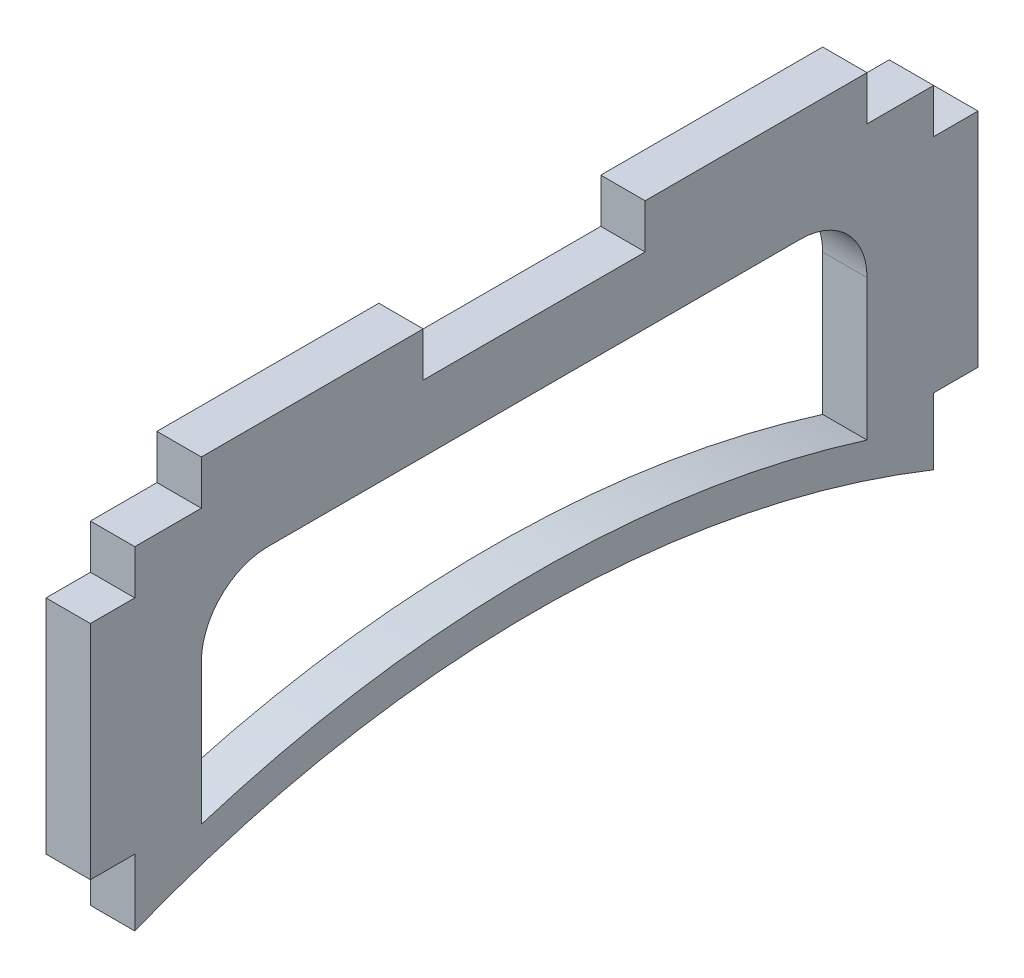
ISO-10303-21;
HEADER;
FILE_DESCRIPTION(('STEP AP214'),'2;1');
FILE_NAME('part.step','',(''),(''),'','','');
FILE_SCHEMA(('AUTOMOTIVE_DESIGN { 1 0 10303 214 1 1 1 1 }'));
ENDSEC;
DATA;
#1=APPLICATION_CONTEXT('core data for automotive mechanical design processes');
#2=APPLICATION_PROTOCOL_DEFINITION('international standard','automotive_design',2000,#1);
#3=PRODUCT_CONTEXT('',#1,'mechanical');
#4=PRODUCT('Part','Part','',(#3));
#5=PRODUCT_RELATED_PRODUCT_CATEGORY('part','',(#4));
#6=PRODUCT_DEFINITION_FORMATION('','',#4);
#7=PRODUCT_DEFINITION_CONTEXT('part definition',#1,'design');
#8=PRODUCT_DEFINITION('design','',#6,#7);
#9=PRODUCT_DEFINITION_SHAPE('','',#8);
#10=(LENGTH_UNIT() NAMED_UNIT(*) SI_UNIT(.MILLI.,.METRE.));
#11=(NAMED_UNIT(*) PLANE_ANGLE_UNIT() SI_UNIT($,.RADIAN.));
#12=(NAMED_UNIT(*) SI_UNIT($,.STERADIAN.) SOLID_ANGLE_UNIT());
#13=UNCERTAINTY_MEASURE_WITH_UNIT(LENGTH_MEASURE(1.E-05),#10,'distance_accuracy_value','');
#14=(GEOMETRIC_REPRESENTATION_CONTEXT(3) GLOBAL_UNCERTAINTY_ASSIGNED_CONTEXT((#13)) GLOBAL_UNIT_ASSIGNED_CONTEXT((#10,
#11,#12)) REPRESENTATION_CONTEXT('',''));
#15=CARTESIAN_POINT('',(0.,0.,0.));
#16=DIRECTION('',(0.,0.,1.));
#17=DIRECTION('',(1.,0.,0.));
#18=AXIS2_PLACEMENT_3D('',#15,#16,#17);
#19=CARTESIAN_POINT('',(2.,-60.0360966337004,0.));
#20=DIRECTION('',(1.,0.,0.));
#21=DIRECTION('',(0.,0.,-1.));
#22=AXIS2_PLACEMENT_3D('',#19,#20,#21);
#23=PLANE('',#22);
#24=DIRECTION('',(0.,-1.,0.));
#25=VECTOR('',#24,1.);
#26=CARTESIAN_POINT('',(2.,0.,18.));
#27=LINE('',#26,#25);
#28=CARTESIAN_POINT('',(2.,0.,18.));
#29=VERTEX_POINT('',#28);
#30=CARTESIAN_POINT('',(2.,-2.,18.));
#31=VERTEX_POINT('',#30);
#32=EDGE_CURVE('E258',#29,#31,#27,.T.);
#33=ORIENTED_EDGE('',*,*,#32,.T.);
#34=DIRECTION('',(0.,0.,1.));
#35=VECTOR('',#34,1.);
#36=CARTESIAN_POINT('',(2.,-2.,18.));
#37=LINE('',#36,#35);
#38=CARTESIAN_POINT('',(2.,-2.,20.));
#39=VERTEX_POINT('',#38);
#40=EDGE_CURVE('E261',#31,#39,#37,.T.);
#41=ORIENTED_EDGE('',*,*,#40,.T.);
#42=DIRECTION('',(0.,-1.,0.));
#43=VECTOR('',#42,1.);
#44=CARTESIAN_POINT('',(2.,-2.,20.));
#45=LINE('',#44,#43);
#46=CARTESIAN_POINT('',(2.,-12.,20.));
#47=VERTEX_POINT('',#46);
#48=EDGE_CURVE('E264',#39,#47,#45,.T.);
#49=ORIENTED_EDGE('',*,*,#48,.T.);
#50=DIRECTION('',(0.,0.,-1.));
#51=VECTOR('',#50,1.);
#52=CARTESIAN_POINT('',(2.,-12.,20.));
#53=LINE('',#52,#51);
#54=CARTESIAN_POINT('',(2.,-12.,18.));
#55=VERTEX_POINT('',#54);
#56=EDGE_CURVE('E266',#47,#55,#53,.T.);
#57=ORIENTED_EDGE('',*,*,#56,.T.);
#58=DIRECTION('',(0.,-1.,0.));
#59=VECTOR('',#58,1.);
#60=CARTESIAN_POINT('',(2.,-12.,18.));
#61=LINE('',#60,#59);
#62=CARTESIAN_POINT('',(2.,-15.,18.));
#63=VERTEX_POINT('',#62);
#64=EDGE_CURVE('E268',#55,#63,#61,.T.);
#65=ORIENTED_EDGE('',*,*,#64,.T.);
#66=CARTESIAN_POINT('',(2.,-60.0360966337004,0.));
#67=DIRECTION('',(-1.,0.,0.));
#68=DIRECTION('',(0.,0.,-1.));
#69=AXIS2_PLACEMENT_3D('',#66,#67,#68);
#70=CIRCLE('',#69,48.5);
#71=CARTESIAN_POINT('',(2.,-15.,-18.));
#72=VERTEX_POINT('',#71);
#73=EDGE_CURVE('E270',#63,#72,#70,.T.);
#74=ORIENTED_EDGE('',*,*,#73,.T.);
#75=DIRECTION('',(0.,1.,0.));
#76=VECTOR('',#75,1.);
#77=CARTESIAN_POINT('',(2.,-12.,-18.));
#78=LINE('',#77,#76);
#79=CARTESIAN_POINT('',(2.,-12.,-18.));
#80=VERTEX_POINT('',#79);
#81=EDGE_CURVE('E272',#72,#80,#78,.T.);
#82=ORIENTED_EDGE('',*,*,#81,.T.);
#83=DIRECTION('',(0.,0.,-1.));
#84=VECTOR('',#83,1.);
#85=CARTESIAN_POINT('',(2.,-12.,-20.));
#86=LINE('',#85,#84);
#87=CARTESIAN_POINT('',(2.,-12.,-20.));
#88=VERTEX_POINT('',#87);
#89=EDGE_CURVE('E274',#80,#88,#86,.T.);
#90=ORIENTED_EDGE('',*,*,#89,.T.);
#91=DIRECTION('',(0.,1.,0.));
#92=VECTOR('',#91,1.);
#93=CARTESIAN_POINT('',(2.,-2.,-20.));
#94=LINE('',#93,#92);
#95=CARTESIAN_POINT('',(2.,-2.,-20.));
#96=VERTEX_POINT('',#95);
#97=EDGE_CURVE('E276',#88,#96,#94,.T.);
#98=ORIENTED_EDGE('',*,*,#97,.T.);
#99=DIRECTION('',(0.,0.,1.));
#100=VECTOR('',#99,1.);
#101=CARTESIAN_POINT('',(2.,-2.,-18.));
#102=LINE('',#101,#100);
#103=CARTESIAN_POINT('',(2.,-2.,-18.));
#104=VERTEX_POINT('',#103);
#105=EDGE_CURVE('E278',#96,#104,#102,.T.);
#106=ORIENTED_EDGE('',*,*,#105,.T.);
#107=DIRECTION('',(0.,1.,0.));
#108=VECTOR('',#107,1.);
#109=CARTESIAN_POINT('',(2.,0.,-18.));
#110=LINE('',#109,#108);
#111=CARTESIAN_POINT('',(2.,0.,-18.));
#112=VERTEX_POINT('',#111);
#113=EDGE_CURVE('E280',#104,#112,#110,.T.);
#114=ORIENTED_EDGE('',*,*,#113,.T.);
#115=DIRECTION('',(0.,0.,1.));
#116=VECTOR('',#115,1.);
#117=CARTESIAN_POINT('',(2.,0.,-15.));
#118=LINE('',#117,#116);
#119=CARTESIAN_POINT('',(2.,0.,-15.));
#120=VERTEX_POINT('',#119);
#121=EDGE_CURVE('E282',#112,#120,#118,.T.);
#122=ORIENTED_EDGE('',*,*,#121,.T.);
#123=DIRECTION('',(0.,1.,0.));
#124=VECTOR('',#123,1.);
#125=CARTESIAN_POINT('',(2.,0.,-15.));
#126=LINE('',#125,#124);
#127=CARTESIAN_POINT('',(2.,2.00000000000001,-15.));
#128=VERTEX_POINT('',#127);
#129=EDGE_CURVE('E284',#120,#128,#126,.T.);
#130=ORIENTED_EDGE('',*,*,#129,.T.);
#131=DIRECTION('',(0.,0.,1.));
#132=VECTOR('',#131,1.);
#133=CARTESIAN_POINT('',(2.,2.00000000000001,-15.));
#134=LINE('',#133,#132);
#135=CARTESIAN_POINT('',(2.,2.00000000000001,-5.));
#136=VERTEX_POINT('',#135);
#137=EDGE_CURVE('E286',#128,#136,#134,.T.);
#138=ORIENTED_EDGE('',*,*,#137,.T.);
#139=DIRECTION('',(0.,-1.,0.));
#140=VECTOR('',#139,1.);
#141=CARTESIAN_POINT('',(2.,0.,-5.));
#142=LINE('',#141,#140);
#143=CARTESIAN_POINT('',(2.,0.,-5.));
#144=VERTEX_POINT('',#143);
#145=EDGE_CURVE('E288',#136,#144,#142,.T.);
#146=ORIENTED_EDGE('',*,*,#145,.T.);
#147=DIRECTION('',(0.,0.,1.));
#148=VECTOR('',#147,1.);
#149=CARTESIAN_POINT('',(2.,0.,5.));
#150=LINE('',#149,#148);
#151=CARTESIAN_POINT('',(2.,0.,5.));
#152=VERTEX_POINT('',#151);
#153=EDGE_CURVE('E290',#144,#152,#150,.T.);
#154=ORIENTED_EDGE('',*,*,#153,.T.);
#155=DIRECTION('',(0.,1.,0.));
#156=VECTOR('',#155,1.);
#157=CARTESIAN_POINT('',(2.,0.,5.));
#158=LINE('',#157,#156);
#159=CARTESIAN_POINT('',(2.,2.,5.));
#160=VERTEX_POINT('',#159);
#161=EDGE_CURVE('E292',#152,#160,#158,.T.);
#162=ORIENTED_EDGE('',*,*,#161,.T.);
#163=DIRECTION('',(0.,0.,1.));
#164=VECTOR('',#163,1.);
#165=CARTESIAN_POINT('',(2.,2.,15.));
#166=LINE('',#165,#164);
#167=CARTESIAN_POINT('',(2.,2.,15.));
#168=VERTEX_POINT('',#167);
#169=EDGE_CURVE('E294',#160,#168,#166,.T.);
#170=ORIENTED_EDGE('',*,*,#169,.T.);
#171=DIRECTION('',(0.,-1.,0.));
#172=VECTOR('',#171,1.);
#173=CARTESIAN_POINT('',(2.,0.,15.));
#174=LINE('',#173,#172);
#175=CARTESIAN_POINT('',(2.,0.,15.));
#176=VERTEX_POINT('',#175);
#177=EDGE_CURVE('E296',#168,#176,#174,.T.);
#178=ORIENTED_EDGE('',*,*,#177,.T.);
#179=DIRECTION('',(0.,0.,1.));
#180=VECTOR('',#179,1.);
#181=CARTESIAN_POINT('',(2.,0.,18.));
#182=LINE('',#181,#180);
#183=EDGE_CURVE('E298',#176,#29,#182,.T.);
#184=ORIENTED_EDGE('',*,*,#183,.T.);
#185=EDGE_LOOP('',(#33,#41,#49,#57,#65,#74,#82,#90,#98,#106,#114,#122,#130,#138,#146,#154,#162,
#170,#178,#184));
#186=FACE_BOUND('',#185,.T.);
#187=DIRECTION('',(0.,1.,0.));
#188=VECTOR('',#187,1.);
#189=CARTESIAN_POINT('',(2.,-6.00000000000002,-15.));
#190=LINE('',#189,#188);
#191=CARTESIAN_POINT('',(2.,-12.3391365628531,-15.));
#192=VERTEX_POINT('',#191);
#193=CARTESIAN_POINT('',(2.,-6.00000000000002,-15.));
#194=VERTEX_POINT('',#193);
#195=EDGE_CURVE('E215',#192,#194,#190,.T.);
#196=ORIENTED_EDGE('',*,*,#195,.F.);
#197=CARTESIAN_POINT('',(2.,-60.0360966337004,0.));
#198=DIRECTION('',(-1.,0.,0.));
#199=DIRECTION('',(0.,0.,-1.));
#200=AXIS2_PLACEMENT_3D('',#197,#198,#199);
#201=CIRCLE('',#200,50.);
#202=CARTESIAN_POINT('',(2.,-12.3391365628531,15.));
#203=VERTEX_POINT('',#202);
#204=EDGE_CURVE('E207',#203,#192,#201,.T.);
#205=ORIENTED_EDGE('',*,*,#204,.F.);
#206=DIRECTION('',(0.,-1.,0.));
#207=VECTOR('',#206,1.);
#208=CARTESIAN_POINT('',(2.,-12.3391365628531,15.));
#209=LINE('',#208,#207);
#210=CARTESIAN_POINT('',(2.,-6.00000000000002,15.));
#211=VERTEX_POINT('',#210);
#212=EDGE_CURVE('E236',#211,#203,#209,.T.);
#213=ORIENTED_EDGE('',*,*,#212,.F.);
#214=CARTESIAN_POINT('',(2.,-6.,12.));
#215=DIRECTION('',(1.,0.,0.));
#216=DIRECTION('',(0.,0.,-1.));
#217=AXIS2_PLACEMENT_3D('',#214,#215,#216);
#218=CIRCLE('',#217,3.);
#219=CARTESIAN_POINT('',(2.,-3.,12.));
#220=VERTEX_POINT('',#219);
#221=EDGE_CURVE('E234',#220,#211,#218,.T.);
#222=ORIENTED_EDGE('',*,*,#221,.F.);
#223=DIRECTION('',(0.,0.,1.));
#224=VECTOR('',#223,1.);
#225=CARTESIAN_POINT('',(2.,-3.,12.));
#226=LINE('',#225,#224);
#227=CARTESIAN_POINT('',(2.,-3.,-12.));
#228=VERTEX_POINT('',#227);
#229=EDGE_CURVE('E230',#228,#220,#226,.T.);
#230=ORIENTED_EDGE('',*,*,#229,.F.);
#231=CARTESIAN_POINT('',(2.,-6.,-12.));
#232=DIRECTION('',(1.,0.,0.));
#233=DIRECTION('',(0.,0.,-1.));
#234=AXIS2_PLACEMENT_3D('',#231,#232,#233);
#235=CIRCLE('',#234,3.);
#236=EDGE_CURVE('E228',#194,#228,#235,.T.);
#237=ORIENTED_EDGE('',*,*,#236,.F.);
#238=EDGE_LOOP('',(#196,#205,#213,#222,#230,#237));
#239=FACE_BOUND('',#238,.T.);
#240=ADVANCED_FACE('F34',(#186,#239),#23,.T.);
#241=CARTESIAN_POINT('',(0.,-60.0360966337004,0.));
#242=DIRECTION('',(1.,0.,0.));
#243=DIRECTION('',(0.,0.,-1.));
#244=AXIS2_PLACEMENT_3D('',#241,#242,#243);
#245=PLANE('',#244);
#246=DIRECTION('',(0.,-1.,0.));
#247=VECTOR('',#246,1.);
#248=CARTESIAN_POINT('',(0.,0.,18.));
#249=LINE('',#248,#247);
#250=CARTESIAN_POINT('',(0.,0.,18.));
#251=VERTEX_POINT('',#250);
#252=CARTESIAN_POINT('',(0.,-2.,18.));
#253=VERTEX_POINT('',#252);
#254=EDGE_CURVE('E223',#251,#253,#249,.T.);
#255=ORIENTED_EDGE('',*,*,#254,.F.);
#256=DIRECTION('',(0.,0.,1.));
#257=VECTOR('',#256,1.);
#258=CARTESIAN_POINT('',(0.,0.,18.));
#259=LINE('',#258,#257);
#260=CARTESIAN_POINT('',(0.,0.,15.));
#261=VERTEX_POINT('',#260);
#262=EDGE_CURVE('E262',#261,#251,#259,.T.);
#263=ORIENTED_EDGE('',*,*,#262,.F.);
#264=DIRECTION('',(0.,-1.,0.));
#265=VECTOR('',#264,1.);
#266=CARTESIAN_POINT('',(0.,0.,15.));
#267=LINE('',#266,#265);
#268=CARTESIAN_POINT('',(0.,2.,15.));
#269=VERTEX_POINT('',#268);
#270=EDGE_CURVE('E337',#269,#261,#267,.T.);
#271=ORIENTED_EDGE('',*,*,#270,.F.);
#272=DIRECTION('',(0.,0.,1.));
#273=VECTOR('',#272,1.);
#274=CARTESIAN_POINT('',(0.,2.,15.));
#275=LINE('',#274,#273);
#276=CARTESIAN_POINT('',(0.,2.,5.));
#277=VERTEX_POINT('',#276);
#278=EDGE_CURVE('E335',#277,#269,#275,.T.);
#279=ORIENTED_EDGE('',*,*,#278,.F.);
#280=DIRECTION('',(0.,1.,0.));
#281=VECTOR('',#280,1.);
#282=CARTESIAN_POINT('',(0.,0.,5.));
#283=LINE('',#282,#281);
#284=CARTESIAN_POINT('',(0.,0.,5.));
#285=VERTEX_POINT('',#284);
#286=EDGE_CURVE('E333',#285,#277,#283,.T.);
#287=ORIENTED_EDGE('',*,*,#286,.F.);
#288=DIRECTION('',(0.,0.,1.));
#289=VECTOR('',#288,1.);
#290=CARTESIAN_POINT('',(0.,0.,5.));
#291=LINE('',#290,#289);
#292=CARTESIAN_POINT('',(0.,0.,-5.));
#293=VERTEX_POINT('',#292);
#294=EDGE_CURVE('E331',#293,#285,#291,.T.);
#295=ORIENTED_EDGE('',*,*,#294,.F.);
#296=DIRECTION('',(0.,-1.,0.));
#297=VECTOR('',#296,1.);
#298=CARTESIAN_POINT('',(0.,0.,-5.));
#299=LINE('',#298,#297);
#300=CARTESIAN_POINT('',(0.,2.00000000000001,-5.));
#301=VERTEX_POINT('',#300);
#302=EDGE_CURVE('E329',#301,#293,#299,.T.);
#303=ORIENTED_EDGE('',*,*,#302,.F.);
#304=DIRECTION('',(0.,0.,1.));
#305=VECTOR('',#304,1.);
#306=CARTESIAN_POINT('',(0.,2.00000000000001,-15.));
#307=LINE('',#306,#305);
#308=CARTESIAN_POINT('',(0.,2.00000000000001,-15.));
#309=VERTEX_POINT('',#308);
#310=EDGE_CURVE('E327',#309,#301,#307,.T.);
#311=ORIENTED_EDGE('',*,*,#310,.F.);
#312=DIRECTION('',(0.,1.,0.));
#313=VECTOR('',#312,1.);
#314=CARTESIAN_POINT('',(0.,0.,-15.));
#315=LINE('',#314,#313);
#316=CARTESIAN_POINT('',(0.,0.,-15.));
#317=VERTEX_POINT('',#316);
#318=EDGE_CURVE('E325',#317,#309,#315,.T.);
#319=ORIENTED_EDGE('',*,*,#318,.F.);
#320=DIRECTION('',(0.,0.,1.));
#321=VECTOR('',#320,1.);
#322=CARTESIAN_POINT('',(0.,0.,-15.));
#323=LINE('',#322,#321);
#324=CARTESIAN_POINT('',(0.,0.,-18.));
#325=VERTEX_POINT('',#324);
#326=EDGE_CURVE('E323',#325,#317,#323,.T.);
#327=ORIENTED_EDGE('',*,*,#326,.F.);
#328=DIRECTION('',(0.,1.,0.));
#329=VECTOR('',#328,1.);
#330=CARTESIAN_POINT('',(0.,0.,-18.));
#331=LINE('',#330,#329);
#332=CARTESIAN_POINT('',(0.,-2.,-18.));
#333=VERTEX_POINT('',#332);
#334=EDGE_CURVE('E321',#333,#325,#331,.T.);
#335=ORIENTED_EDGE('',*,*,#334,.F.);
#336=DIRECTION('',(0.,0.,1.));
#337=VECTOR('',#336,1.);
#338=CARTESIAN_POINT('',(0.,-2.,-18.));
#339=LINE('',#338,#337);
#340=CARTESIAN_POINT('',(0.,-2.,-20.));
#341=VERTEX_POINT('',#340);
#342=EDGE_CURVE('E319',#341,#333,#339,.T.);
#343=ORIENTED_EDGE('',*,*,#342,.F.);
#344=DIRECTION('',(0.,1.,0.));
#345=VECTOR('',#344,1.);
#346=CARTESIAN_POINT('',(0.,-2.,-20.));
#347=LINE('',#346,#345);
#348=CARTESIAN_POINT('',(0.,-12.,-20.));
#349=VERTEX_POINT('',#348);
#350=EDGE_CURVE('E317',#349,#341,#347,.T.);
#351=ORIENTED_EDGE('',*,*,#350,.F.);
#352=DIRECTION('',(0.,0.,-1.));
#353=VECTOR('',#352,1.);
#354=CARTESIAN_POINT('',(0.,-12.,-20.));
#355=LINE('',#354,#353);
#356=CARTESIAN_POINT('',(0.,-12.,-18.));
#357=VERTEX_POINT('',#356);
#358=EDGE_CURVE('E315',#357,#349,#355,.T.);
#359=ORIENTED_EDGE('',*,*,#358,.F.);
#360=DIRECTION('',(0.,1.,0.));
#361=VECTOR('',#360,1.);
#362=CARTESIAN_POINT('',(0.,-12.,-18.));
#363=LINE('',#362,#361);
#364=CARTESIAN_POINT('',(0.,-15.,-18.));
#365=VERTEX_POINT('',#364);
#366=EDGE_CURVE('E313',#365,#357,#363,.T.);
#367=ORIENTED_EDGE('',*,*,#366,.F.);
#368=CARTESIAN_POINT('',(0.,-60.0360966337004,0.));
#369=DIRECTION('',(-1.,0.,0.));
#370=DIRECTION('',(0.,0.,-1.));
#371=AXIS2_PLACEMENT_3D('',#368,#369,#370);
#372=CIRCLE('',#371,48.5);
#373=CARTESIAN_POINT('',(0.,-15.,18.));
#374=VERTEX_POINT('',#373);
#375=EDGE_CURVE('E311',#374,#365,#372,.T.);
#376=ORIENTED_EDGE('',*,*,#375,.F.);
#377=DIRECTION('',(0.,-1.,0.));
#378=VECTOR('',#377,1.);
#379=CARTESIAN_POINT('',(0.,-12.,18.));
#380=LINE('',#379,#378);
#381=CARTESIAN_POINT('',(0.,-12.,18.));
#382=VERTEX_POINT('',#381);
#383=EDGE_CURVE('E309',#382,#374,#380,.T.);
#384=ORIENTED_EDGE('',*,*,#383,.F.);
#385=DIRECTION('',(0.,0.,-1.));
#386=VECTOR('',#385,1.);
#387=CARTESIAN_POINT('',(0.,-12.,20.));
#388=LINE('',#387,#386);
#389=CARTESIAN_POINT('',(0.,-12.,20.));
#390=VERTEX_POINT('',#389);
#391=EDGE_CURVE('E307',#390,#382,#388,.T.);
#392=ORIENTED_EDGE('',*,*,#391,.F.);
#393=DIRECTION('',(0.,-1.,0.));
#394=VECTOR('',#393,1.);
#395=CARTESIAN_POINT('',(0.,-2.,20.));
#396=LINE('',#395,#394);
#397=CARTESIAN_POINT('',(0.,-2.,20.));
#398=VERTEX_POINT('',#397);
#399=EDGE_CURVE('E305',#398,#390,#396,.T.);
#400=ORIENTED_EDGE('',*,*,#399,.F.);
#401=DIRECTION('',(0.,0.,1.));
#402=VECTOR('',#401,1.);
#403=CARTESIAN_POINT('',(0.,-2.,18.));
#404=LINE('',#403,#402);
#405=EDGE_CURVE('E303',#253,#398,#404,.T.);
#406=ORIENTED_EDGE('',*,*,#405,.F.);
#407=EDGE_LOOP('',(#255,#263,#271,#279,#287,#295,#303,#311,#319,#327,#335,#343,#351,#359,#367,
#376,#384,#392,#400,#406));
#408=FACE_BOUND('',#407,.T.);
#409=CARTESIAN_POINT('',(0.,-60.0360966337004,0.));
#410=DIRECTION('',(-1.,0.,0.));
#411=DIRECTION('',(0.,0.,-1.));
#412=AXIS2_PLACEMENT_3D('',#409,#410,#411);
#413=CIRCLE('',#412,50.);
#414=CARTESIAN_POINT('',(0.,-12.3391365628531,15.));
#415=VERTEX_POINT('',#414);
#416=CARTESIAN_POINT('',(0.,-12.3391365628531,-15.));
#417=VERTEX_POINT('',#416);
#418=EDGE_CURVE('E57',#415,#417,#413,.T.);
#419=ORIENTED_EDGE('',*,*,#418,.T.);
#420=DIRECTION('',(0.,1.,0.));
#421=VECTOR('',#420,1.);
#422=CARTESIAN_POINT('',(0.,-6.00000000000002,-15.));
#423=LINE('',#422,#421);
#424=CARTESIAN_POINT('',(0.,-6.00000000000002,-15.));
#425=VERTEX_POINT('',#424);
#426=EDGE_CURVE('E222',#417,#425,#423,.T.);
#427=ORIENTED_EDGE('',*,*,#426,.T.);
#428=CARTESIAN_POINT('',(0.,-6.,-12.));
#429=DIRECTION('',(1.,0.,0.));
#430=DIRECTION('',(0.,0.,-1.));
#431=AXIS2_PLACEMENT_3D('',#428,#429,#430);
#432=CIRCLE('',#431,3.);
#433=CARTESIAN_POINT('',(0.,-3.,-12.));
#434=VERTEX_POINT('',#433);
#435=EDGE_CURVE('E240',#425,#434,#432,.T.);
#436=ORIENTED_EDGE('',*,*,#435,.T.);
#437=DIRECTION('',(0.,0.,1.));
#438=VECTOR('',#437,1.);
#439=CARTESIAN_POINT('',(0.,-3.,12.));
#440=LINE('',#439,#438);
#441=CARTESIAN_POINT('',(0.,-3.,12.));
#442=VERTEX_POINT('',#441);
#443=EDGE_CURVE('E243',#434,#442,#440,.T.);
#444=ORIENTED_EDGE('',*,*,#443,.T.);
#445=CARTESIAN_POINT('',(0.,-6.,12.));
#446=DIRECTION('',(1.,0.,0.));
#447=DIRECTION('',(0.,0.,-1.));
#448=AXIS2_PLACEMENT_3D('',#445,#446,#447);
#449=CIRCLE('',#448,3.);
#450=CARTESIAN_POINT('',(0.,-6.00000000000002,15.));
#451=VERTEX_POINT('',#450);
#452=EDGE_CURVE('E246',#442,#451,#449,.T.);
#453=ORIENTED_EDGE('',*,*,#452,.T.);
#454=DIRECTION('',(0.,-1.,0.));
#455=VECTOR('',#454,1.);
#456=CARTESIAN_POINT('',(0.,-12.3391365628531,15.));
#457=LINE('',#456,#455);
#458=EDGE_CURVE('E216',#451,#415,#457,.T.);
#459=ORIENTED_EDGE('',*,*,#458,.T.);
#460=EDGE_LOOP('',(#419,#427,#436,#444,#453,#459));
#461=FACE_BOUND('',#460,.T.);
#462=ADVANCED_FACE('F403',(#408,#461),#245,.F.);
#463=CARTESIAN_POINT('',(2.,0.,18.));
#464=DIRECTION('',(0.,0.,-1.));
#465=DIRECTION('',(-1.,0.,0.));
#466=AXIS2_PLACEMENT_3D('',#463,#464,#465);
#467=PLANE('',#466);
#468=ORIENTED_EDGE('',*,*,#254,.T.);
#469=DIRECTION('',(-1.,0.,0.));
#470=VECTOR('',#469,1.);
#471=CARTESIAN_POINT('',(2.,-2.,18.));
#472=LINE('',#471,#470);
#473=EDGE_CURVE('E11',#31,#253,#472,.T.);
#474=ORIENTED_EDGE('',*,*,#473,.F.);
#475=ORIENTED_EDGE('',*,*,#32,.F.);
#476=DIRECTION('',(-1.,0.,0.));
#477=VECTOR('',#476,1.);
#478=CARTESIAN_POINT('',(2.,0.,18.));
#479=LINE('',#478,#477);
#480=EDGE_CURVE('E300',#29,#251,#479,.T.);
#481=ORIENTED_EDGE('',*,*,#480,.T.);
#482=EDGE_LOOP('',(#468,#474,#475,#481));
#483=FACE_BOUND('',#482,.T.);
#484=ADVANCED_FACE('F36',(#483),#467,.F.);
#485=CARTESIAN_POINT('',(2.,-2.,18.));
#486=DIRECTION('',(0.,-1.,0.));
#487=DIRECTION('',(0.,0.,-1.));
#488=AXIS2_PLACEMENT_3D('',#485,#486,#487);
#489=PLANE('',#488);
#490=ORIENTED_EDGE('',*,*,#405,.T.);
#491=DIRECTION('',(-1.,0.,0.));
#492=VECTOR('',#491,1.);
#493=CARTESIAN_POINT('',(2.,-2.,20.));
#494=LINE('',#493,#492);
#495=EDGE_CURVE('E42',#39,#398,#494,.T.);
#496=ORIENTED_EDGE('',*,*,#495,.F.);
#497=ORIENTED_EDGE('',*,*,#40,.F.);
#498=ORIENTED_EDGE('',*,*,#473,.T.);
#499=EDGE_LOOP('',(#490,#496,#497,#498));
#500=FACE_BOUND('',#499,.T.);
#501=ADVANCED_FACE('F420',(#500),#489,.F.);
#502=CARTESIAN_POINT('',(2.,-2.,20.));
#503=DIRECTION('',(0.,0.,-1.));
#504=DIRECTION('',(-1.,0.,0.));
#505=AXIS2_PLACEMENT_3D('',#502,#503,#504);
#506=PLANE('',#505);
#507=ORIENTED_EDGE('',*,*,#399,.T.);
#508=DIRECTION('',(-1.,0.,0.));
#509=VECTOR('',#508,1.);
#510=CARTESIAN_POINT('',(2.,-12.,20.));
#511=LINE('',#510,#509);
#512=EDGE_CURVE('E390',#47,#390,#511,.T.);
#513=ORIENTED_EDGE('',*,*,#512,.F.);
#514=ORIENTED_EDGE('',*,*,#48,.F.);
#515=ORIENTED_EDGE('',*,*,#495,.T.);
#516=EDGE_LOOP('',(#507,#513,#514,#515));
#517=FACE_BOUND('',#516,.T.);
#518=ADVANCED_FACE('F397',(#517),#506,.F.);
#519=CARTESIAN_POINT('',(2.,-12.,20.));
#520=DIRECTION('',(0.,1.,0.));
#521=DIRECTION('',(0.,0.,1.));
#522=AXIS2_PLACEMENT_3D('',#519,#520,#521);
#523=PLANE('',#522);
#524=ORIENTED_EDGE('',*,*,#391,.T.);
#525=DIRECTION('',(-1.,0.,0.));
#526=VECTOR('',#525,1.);
#527=CARTESIAN_POINT('',(2.,-12.,18.));
#528=LINE('',#527,#526);
#529=EDGE_CURVE('E387',#55,#382,#528,.T.);
#530=ORIENTED_EDGE('',*,*,#529,.F.);
#531=ORIENTED_EDGE('',*,*,#56,.F.);
#532=ORIENTED_EDGE('',*,*,#512,.T.);
#533=EDGE_LOOP('',(#524,#530,#531,#532));
#534=FACE_BOUND('',#533,.T.);
#535=ADVANCED_FACE('F409',(#534),#523,.F.);
#536=CARTESIAN_POINT('',(2.,-12.,18.));
#537=DIRECTION('',(0.,0.,-1.));
#538=DIRECTION('',(-1.,0.,0.));
#539=AXIS2_PLACEMENT_3D('',#536,#537,#538);
#540=PLANE('',#539);
#541=ORIENTED_EDGE('',*,*,#383,.T.);
#542=DIRECTION('',(-1.,0.,0.));
#543=VECTOR('',#542,1.);
#544=CARTESIAN_POINT('',(2.,-15.,18.));
#545=LINE('',#544,#543);
#546=EDGE_CURVE('E384',#63,#374,#545,.T.);
#547=ORIENTED_EDGE('',*,*,#546,.F.);
#548=ORIENTED_EDGE('',*,*,#64,.F.);
#549=ORIENTED_EDGE('',*,*,#529,.T.);
#550=EDGE_LOOP('',(#541,#547,#548,#549));
#551=FACE_BOUND('',#550,.T.);
#552=ADVANCED_FACE('F413',(#551),#540,.F.);
#553=CARTESIAN_POINT('',(2.,-60.0360966337004,0.));
#554=DIRECTION('',(-1.,0.,0.));
#555=DIRECTION('',(0.,0.,1.));
#556=AXIS2_PLACEMENT_3D('',#553,#554,#555);
#557=CYLINDRICAL_SURFACE('',#556,48.5);
#558=ORIENTED_EDGE('',*,*,#375,.T.);
#559=DIRECTION('',(-1.,0.,0.));
#560=VECTOR('',#559,1.);
#561=CARTESIAN_POINT('',(2.,-15.,-18.));
#562=LINE('',#561,#560);
#563=EDGE_CURVE('E381',#72,#365,#562,.T.);
#564=ORIENTED_EDGE('',*,*,#563,.F.);
#565=ORIENTED_EDGE('',*,*,#73,.F.);
#566=ORIENTED_EDGE('',*,*,#546,.T.);
#567=EDGE_LOOP('',(#558,#564,#565,#566));
#568=FACE_BOUND('',#567,.T.);
#569=ADVANCED_FACE('F493',(#568),#557,.F.);
#570=CARTESIAN_POINT('',(2.,-12.,-18.));
#571=DIRECTION('',(0.,0.,1.));
#572=DIRECTION('',(1.,0.,0.));
#573=AXIS2_PLACEMENT_3D('',#570,#571,#572);
#574=PLANE('',#573);
#575=ORIENTED_EDGE('',*,*,#366,.T.);
#576=DIRECTION('',(-1.,0.,0.));
#577=VECTOR('',#576,1.);
#578=CARTESIAN_POINT('',(2.,-12.,-18.));
#579=LINE('',#578,#577);
#580=EDGE_CURVE('E378',#80,#357,#579,.T.);
#581=ORIENTED_EDGE('',*,*,#580,.F.);
#582=ORIENTED_EDGE('',*,*,#81,.F.);
#583=ORIENTED_EDGE('',*,*,#563,.T.);
#584=EDGE_LOOP('',(#575,#581,#582,#583));
#585=FACE_BOUND('',#584,.T.);
#586=ADVANCED_FACE('F491',(#585),#574,.F.);
#587=CARTESIAN_POINT('',(2.,-12.,-20.));
#588=DIRECTION('',(0.,1.,0.));
#589=DIRECTION('',(0.,0.,1.));
#590=AXIS2_PLACEMENT_3D('',#587,#588,#589);
#591=PLANE('',#590);
#592=ORIENTED_EDGE('',*,*,#358,.T.);
#593=DIRECTION('',(-1.,0.,0.));
#594=VECTOR('',#593,1.);
#595=CARTESIAN_POINT('',(2.,-12.,-20.));
#596=LINE('',#595,#594);
#597=EDGE_CURVE('E375',#88,#349,#596,.T.);
#598=ORIENTED_EDGE('',*,*,#597,.F.);
#599=ORIENTED_EDGE('',*,*,#89,.F.);
#600=ORIENTED_EDGE('',*,*,#580,.T.);
#601=EDGE_LOOP('',(#592,#598,#599,#600));
#602=FACE_BOUND('',#601,.T.);
#603=ADVANCED_FACE('F486',(#602),#591,.F.);
#604=CARTESIAN_POINT('',(2.,-2.,-20.));
#605=DIRECTION('',(0.,0.,1.));
#606=DIRECTION('',(1.,0.,0.));
#607=AXIS2_PLACEMENT_3D('',#604,#605,#606);
#608=PLANE('',#607);
#609=ORIENTED_EDGE('',*,*,#350,.T.);
#610=DIRECTION('',(-1.,0.,0.));
#611=VECTOR('',#610,1.);
#612=CARTESIAN_POINT('',(2.,-2.,-20.));
#613=LINE('',#612,#611);
#614=EDGE_CURVE('E372',#96,#341,#613,.T.);
#615=ORIENTED_EDGE('',*,*,#614,.F.);
#616=ORIENTED_EDGE('',*,*,#97,.F.);
#617=ORIENTED_EDGE('',*,*,#597,.T.);
#618=EDGE_LOOP('',(#609,#615,#616,#617));
#619=FACE_BOUND('',#618,.T.);
#620=ADVANCED_FACE('F481',(#619),#608,.F.);
#621=CARTESIAN_POINT('',(2.,-2.,-18.));
#622=DIRECTION('',(0.,-1.,0.));
#623=DIRECTION('',(0.,0.,-1.));
#624=AXIS2_PLACEMENT_3D('',#621,#622,#623);
#625=PLANE('',#624);
#626=ORIENTED_EDGE('',*,*,#342,.T.);
#627=DIRECTION('',(-1.,0.,0.));
#628=VECTOR('',#627,1.);
#629=CARTESIAN_POINT('',(2.,-2.,-18.));
#630=LINE('',#629,#628);
#631=EDGE_CURVE('E369',#104,#333,#630,.T.);
#632=ORIENTED_EDGE('',*,*,#631,.F.);
#633=ORIENTED_EDGE('',*,*,#105,.F.);
#634=ORIENTED_EDGE('',*,*,#614,.T.);
#635=EDGE_LOOP('',(#626,#632,#633,#634));
#636=FACE_BOUND('',#635,.T.);
#637=ADVANCED_FACE('F477',(#636),#625,.F.);
#638=CARTESIAN_POINT('',(2.,0.,-18.));
#639=DIRECTION('',(0.,0.,1.));
#640=DIRECTION('',(1.,0.,0.));
#641=AXIS2_PLACEMENT_3D('',#638,#639,#640);
#642=PLANE('',#641);
#643=ORIENTED_EDGE('',*,*,#334,.T.);
#644=DIRECTION('',(-1.,0.,0.));
#645=VECTOR('',#644,1.);
#646=CARTESIAN_POINT('',(2.,0.,-18.));
#647=LINE('',#646,#645);
#648=EDGE_CURVE('E366',#112,#325,#647,.T.);
#649=ORIENTED_EDGE('',*,*,#648,.F.);
#650=ORIENTED_EDGE('',*,*,#113,.F.);
#651=ORIENTED_EDGE('',*,*,#631,.T.);
#652=EDGE_LOOP('',(#643,#649,#650,#651));
#653=FACE_BOUND('',#652,.T.);
#654=ADVANCED_FACE('F472',(#653),#642,.F.);
#655=CARTESIAN_POINT('',(2.,0.,-15.));
#656=DIRECTION('',(0.,-1.,0.));
#657=DIRECTION('',(0.,0.,-1.));
#658=AXIS2_PLACEMENT_3D('',#655,#656,#657);
#659=PLANE('',#658);
#660=ORIENTED_EDGE('',*,*,#326,.T.);
#661=DIRECTION('',(-1.,0.,0.));
#662=VECTOR('',#661,1.);
#663=CARTESIAN_POINT('',(2.,0.,-15.));
#664=LINE('',#663,#662);
#665=EDGE_CURVE('E363',#120,#317,#664,.T.);
#666=ORIENTED_EDGE('',*,*,#665,.F.);
#667=ORIENTED_EDGE('',*,*,#121,.F.);
#668=ORIENTED_EDGE('',*,*,#648,.T.);
#669=EDGE_LOOP('',(#660,#666,#667,#668));
#670=FACE_BOUND('',#669,.T.);
#671=ADVANCED_FACE('F466',(#670),#659,.F.);
#672=CARTESIAN_POINT('',(2.,0.,-15.));
#673=DIRECTION('',(0.,0.,1.));
#674=DIRECTION('',(1.,0.,0.));
#675=AXIS2_PLACEMENT_3D('',#672,#673,#674);
#676=PLANE('',#675);
#677=ORIENTED_EDGE('',*,*,#318,.T.);
#678=DIRECTION('',(-1.,0.,0.));
#679=VECTOR('',#678,1.);
#680=CARTESIAN_POINT('',(2.,2.00000000000001,-15.));
#681=LINE('',#680,#679);
#682=EDGE_CURVE('E360',#128,#309,#681,.T.);
#683=ORIENTED_EDGE('',*,*,#682,.F.);
#684=ORIENTED_EDGE('',*,*,#129,.F.);
#685=ORIENTED_EDGE('',*,*,#665,.T.);
#686=EDGE_LOOP('',(#677,#683,#684,#685));
#687=FACE_BOUND('',#686,.T.);
#688=ADVANCED_FACE('F462',(#687),#676,.F.);
#689=CARTESIAN_POINT('',(2.,2.00000000000001,-15.));
#690=DIRECTION('',(0.,-1.,0.));
#691=DIRECTION('',(0.,0.,-1.));
#692=AXIS2_PLACEMENT_3D('',#689,#690,#691);
#693=PLANE('',#692);
#694=ORIENTED_EDGE('',*,*,#310,.T.);
#695=DIRECTION('',(-1.,0.,0.));
#696=VECTOR('',#695,1.);
#697=CARTESIAN_POINT('',(2.,2.00000000000001,-5.));
#698=LINE('',#697,#696);
#699=EDGE_CURVE('E357',#136,#301,#698,.T.);
#700=ORIENTED_EDGE('',*,*,#699,.F.);
#701=ORIENTED_EDGE('',*,*,#137,.F.);
#702=ORIENTED_EDGE('',*,*,#682,.T.);
#703=EDGE_LOOP('',(#694,#700,#701,#702));
#704=FACE_BOUND('',#703,.T.);
#705=ADVANCED_FACE('F457',(#704),#693,.F.);
#706=CARTESIAN_POINT('',(2.,0.,-5.));
#707=DIRECTION('',(0.,0.,-1.));
#708=DIRECTION('',(-1.,0.,0.));
#709=AXIS2_PLACEMENT_3D('',#706,#707,#708);
#710=PLANE('',#709);
#711=ORIENTED_EDGE('',*,*,#302,.T.);
#712=DIRECTION('',(-1.,0.,0.));
#713=VECTOR('',#712,1.);
#714=CARTESIAN_POINT('',(2.,0.,-5.));
#715=LINE('',#714,#713);
#716=EDGE_CURVE('E354',#144,#293,#715,.T.);
#717=ORIENTED_EDGE('',*,*,#716,.F.);
#718=ORIENTED_EDGE('',*,*,#145,.F.);
#719=ORIENTED_EDGE('',*,*,#699,.T.);
#720=EDGE_LOOP('',(#711,#717,#718,#719));
#721=FACE_BOUND('',#720,.T.);
#722=ADVANCED_FACE('F451',(#721),#710,.F.);
#723=CARTESIAN_POINT('',(2.,0.,5.));
#724=DIRECTION('',(0.,-1.,0.));
#725=DIRECTION('',(0.,0.,-1.));
#726=AXIS2_PLACEMENT_3D('',#723,#724,#725);
#727=PLANE('',#726);
#728=ORIENTED_EDGE('',*,*,#294,.T.);
#729=DIRECTION('',(-1.,0.,0.));
#730=VECTOR('',#729,1.);
#731=CARTESIAN_POINT('',(2.,0.,5.));
#732=LINE('',#731,#730);
#733=EDGE_CURVE('E351',#152,#285,#732,.T.);
#734=ORIENTED_EDGE('',*,*,#733,.F.);
#735=ORIENTED_EDGE('',*,*,#153,.F.);
#736=ORIENTED_EDGE('',*,*,#716,.T.);
#737=EDGE_LOOP('',(#728,#734,#735,#736));
#738=FACE_BOUND('',#737,.T.);
#739=ADVANCED_FACE('F447',(#738),#727,.F.);
#740=CARTESIAN_POINT('',(2.,0.,5.));
#741=DIRECTION('',(0.,0.,1.));
#742=DIRECTION('',(1.,0.,0.));
#743=AXIS2_PLACEMENT_3D('',#740,#741,#742);
#744=PLANE('',#743);
#745=ORIENTED_EDGE('',*,*,#286,.T.);
#746=DIRECTION('',(-1.,0.,0.));
#747=VECTOR('',#746,1.);
#748=CARTESIAN_POINT('',(2.,2.,5.));
#749=LINE('',#748,#747);
#750=EDGE_CURVE('E348',#160,#277,#749,.T.);
#751=ORIENTED_EDGE('',*,*,#750,.F.);
#752=ORIENTED_EDGE('',*,*,#161,.F.);
#753=ORIENTED_EDGE('',*,*,#733,.T.);
#754=EDGE_LOOP('',(#745,#751,#752,#753));
#755=FACE_BOUND('',#754,.T.);
#756=ADVANCED_FACE('F442',(#755),#744,.F.);
#757=CARTESIAN_POINT('',(2.,2.,15.));
#758=DIRECTION('',(0.,-1.,0.));
#759=DIRECTION('',(0.,0.,-1.));
#760=AXIS2_PLACEMENT_3D('',#757,#758,#759);
#761=PLANE('',#760);
#762=ORIENTED_EDGE('',*,*,#278,.T.);
#763=DIRECTION('',(-1.,0.,0.));
#764=VECTOR('',#763,1.);
#765=CARTESIAN_POINT('',(2.,2.,15.));
#766=LINE('',#765,#764);
#767=EDGE_CURVE('E345',#168,#269,#766,.T.);
#768=ORIENTED_EDGE('',*,*,#767,.F.);
#769=ORIENTED_EDGE('',*,*,#169,.F.);
#770=ORIENTED_EDGE('',*,*,#750,.T.);
#771=EDGE_LOOP('',(#762,#768,#769,#770));
#772=FACE_BOUND('',#771,.T.);
#773=ADVANCED_FACE('F436',(#772),#761,.F.);
#774=CARTESIAN_POINT('',(2.,0.,15.));
#775=DIRECTION('',(0.,0.,-1.));
#776=DIRECTION('',(-1.,0.,0.));
#777=AXIS2_PLACEMENT_3D('',#774,#775,#776);
#778=PLANE('',#777);
#779=ORIENTED_EDGE('',*,*,#270,.T.);
#780=DIRECTION('',(-1.,0.,0.));
#781=VECTOR('',#780,1.);
#782=CARTESIAN_POINT('',(2.,0.,15.));
#783=LINE('',#782,#781);
#784=EDGE_CURVE('E342',#176,#261,#783,.T.);
#785=ORIENTED_EDGE('',*,*,#784,.F.);
#786=ORIENTED_EDGE('',*,*,#177,.F.);
#787=ORIENTED_EDGE('',*,*,#767,.T.);
#788=EDGE_LOOP('',(#779,#785,#786,#787));
#789=FACE_BOUND('',#788,.T.);
#790=ADVANCED_FACE('F432',(#789),#778,.F.);
#791=CARTESIAN_POINT('',(2.,0.,18.));
#792=DIRECTION('',(0.,-1.,0.));
#793=DIRECTION('',(0.,0.,-1.));
#794=AXIS2_PLACEMENT_3D('',#791,#792,#793);
#795=PLANE('',#794);
#796=ORIENTED_EDGE('',*,*,#262,.T.);
#797=ORIENTED_EDGE('',*,*,#480,.F.);
#798=ORIENTED_EDGE('',*,*,#183,.F.);
#799=ORIENTED_EDGE('',*,*,#784,.T.);
#800=EDGE_LOOP('',(#796,#797,#798,#799));
#801=FACE_BOUND('',#800,.T.);
#802=ADVANCED_FACE('F427',(#801),#795,.F.);
#803=CARTESIAN_POINT('',(2.,-60.0360966337004,0.));
#804=DIRECTION('',(-1.,0.,0.));
#805=DIRECTION('',(0.,0.,1.));
#806=AXIS2_PLACEMENT_3D('',#803,#804,#805);
#807=CYLINDRICAL_SURFACE('',#806,50.);
#808=ORIENTED_EDGE('',*,*,#418,.F.);
#809=DIRECTION('',(-1.,0.,0.));
#810=VECTOR('',#809,1.);
#811=CARTESIAN_POINT('',(2.,-12.3391365628531,15.));
#812=LINE('',#811,#810);
#813=EDGE_CURVE('E211',#203,#415,#812,.T.);
#814=ORIENTED_EDGE('',*,*,#813,.F.);
#815=ORIENTED_EDGE('',*,*,#204,.T.);
#816=DIRECTION('',(-1.,0.,0.));
#817=VECTOR('',#816,1.);
#818=CARTESIAN_POINT('',(2.,-12.3391365628531,-15.));
#819=LINE('',#818,#817);
#820=EDGE_CURVE('E210',#192,#417,#819,.T.);
#821=ORIENTED_EDGE('',*,*,#820,.T.);
#822=EDGE_LOOP('',(#808,#814,#815,#821));
#823=FACE_BOUND('',#822,.T.);
#824=ADVANCED_FACE('F209',(#823),#807,.T.);
#825=CARTESIAN_POINT('',(2.,-6.00000000000002,-15.));
#826=DIRECTION('',(0.,0.,1.));
#827=DIRECTION('',(0.,-1.,0.));
#828=AXIS2_PLACEMENT_3D('',#825,#826,#827);
#829=PLANE('',#828);
#830=ORIENTED_EDGE('',*,*,#426,.F.);
#831=ORIENTED_EDGE('',*,*,#820,.F.);
#832=ORIENTED_EDGE('',*,*,#195,.T.);
#833=DIRECTION('',(-1.,0.,0.));
#834=VECTOR('',#833,1.);
#835=CARTESIAN_POINT('',(2.,-6.00000000000002,-15.));
#836=LINE('',#835,#834);
#837=EDGE_CURVE('E224',#194,#425,#836,.T.);
#838=ORIENTED_EDGE('',*,*,#837,.T.);
#839=EDGE_LOOP('',(#830,#831,#832,#838));
#840=FACE_BOUND('',#839,.T.);
#841=ADVANCED_FACE('F219',(#840),#829,.T.);
#842=CARTESIAN_POINT('',(2.,-6.,-12.));
#843=DIRECTION('',(-1.,0.,0.));
#844=DIRECTION('',(0.,0.,1.));
#845=AXIS2_PLACEMENT_3D('',#842,#843,#844);
#846=CYLINDRICAL_SURFACE('',#845,3.);
#847=ORIENTED_EDGE('',*,*,#435,.F.);
#848=ORIENTED_EDGE('',*,*,#837,.F.);
#849=ORIENTED_EDGE('',*,*,#236,.T.);
#850=DIRECTION('',(-1.,0.,0.));
#851=VECTOR('',#850,1.);
#852=CARTESIAN_POINT('',(2.,-3.,-12.));
#853=LINE('',#852,#851);
#854=EDGE_CURVE('E255',#228,#434,#853,.T.);
#855=ORIENTED_EDGE('',*,*,#854,.T.);
#856=EDGE_LOOP('',(#847,#848,#849,#855));
#857=FACE_BOUND('',#856,.T.);
#858=ADVANCED_FACE('F599',(#857),#846,.F.);
#859=CARTESIAN_POINT('',(2.,-3.,12.));
#860=DIRECTION('',(0.,-1.,0.));
#861=DIRECTION('',(0.,0.,-1.));
#862=AXIS2_PLACEMENT_3D('',#859,#860,#861);
#863=PLANE('',#862);
#864=ORIENTED_EDGE('',*,*,#443,.F.);
#865=ORIENTED_EDGE('',*,*,#854,.F.);
#866=ORIENTED_EDGE('',*,*,#229,.T.);
#867=DIRECTION('',(-1.,0.,0.));
#868=VECTOR('',#867,1.);
#869=CARTESIAN_POINT('',(2.,-3.,12.));
#870=LINE('',#869,#868);
#871=EDGE_CURVE('E253',#220,#442,#870,.T.);
#872=ORIENTED_EDGE('',*,*,#871,.T.);
#873=EDGE_LOOP('',(#864,#865,#866,#872));
#874=FACE_BOUND('',#873,.T.);
#875=ADVANCED_FACE('F605',(#874),#863,.T.);
#876=CARTESIAN_POINT('',(2.,-6.,12.));
#877=DIRECTION('',(-1.,0.,0.));
#878=DIRECTION('',(0.,0.,1.));
#879=AXIS2_PLACEMENT_3D('',#876,#877,#878);
#880=CYLINDRICAL_SURFACE('',#879,3.);
#881=ORIENTED_EDGE('',*,*,#452,.F.);
#882=ORIENTED_EDGE('',*,*,#871,.F.);
#883=ORIENTED_EDGE('',*,*,#221,.T.);
#884=DIRECTION('',(-1.,0.,0.));
#885=VECTOR('',#884,1.);
#886=CARTESIAN_POINT('',(2.,-6.00000000000002,15.));
#887=LINE('',#886,#885);
#888=EDGE_CURVE('E49',#211,#451,#887,.T.);
#889=ORIENTED_EDGE('',*,*,#888,.T.);
#890=EDGE_LOOP('',(#881,#882,#883,#889));
#891=FACE_BOUND('',#890,.T.);
#892=ADVANCED_FACE('F613',(#891),#880,.F.);
#893=CARTESIAN_POINT('',(2.,-12.3391365628531,15.));
#894=DIRECTION('',(0.,0.,-1.));
#895=DIRECTION('',(-1.,0.,0.));
#896=AXIS2_PLACEMENT_3D('',#893,#894,#895);
#897=PLANE('',#896);
#898=ORIENTED_EDGE('',*,*,#458,.F.);
#899=ORIENTED_EDGE('',*,*,#888,.F.);
#900=ORIENTED_EDGE('',*,*,#212,.T.);
#901=ORIENTED_EDGE('',*,*,#813,.T.);
#902=EDGE_LOOP('',(#898,#899,#900,#901));
#903=FACE_BOUND('',#902,.T.);
#904=ADVANCED_FACE('F621',(#903),#897,.T.);
#905=CLOSED_SHELL('',(#240,#462,#484,#501,#518,#535,#552,#569,#586,#603,#620,#637,#654,#671,
#688,#705,#722,#739,#756,#773,#790,#802,#824,#841,#858,#875,#892,#904));
#906=MANIFOLD_SOLID_BREP('B2',#905);
#907=ADVANCED_BREP_SHAPE_REPRESENTATION('',(#18,#906),#14);
#908=SHAPE_DEFINITION_REPRESENTATION(#9,#907);
ENDSEC;
END-ISO-10303-21;
